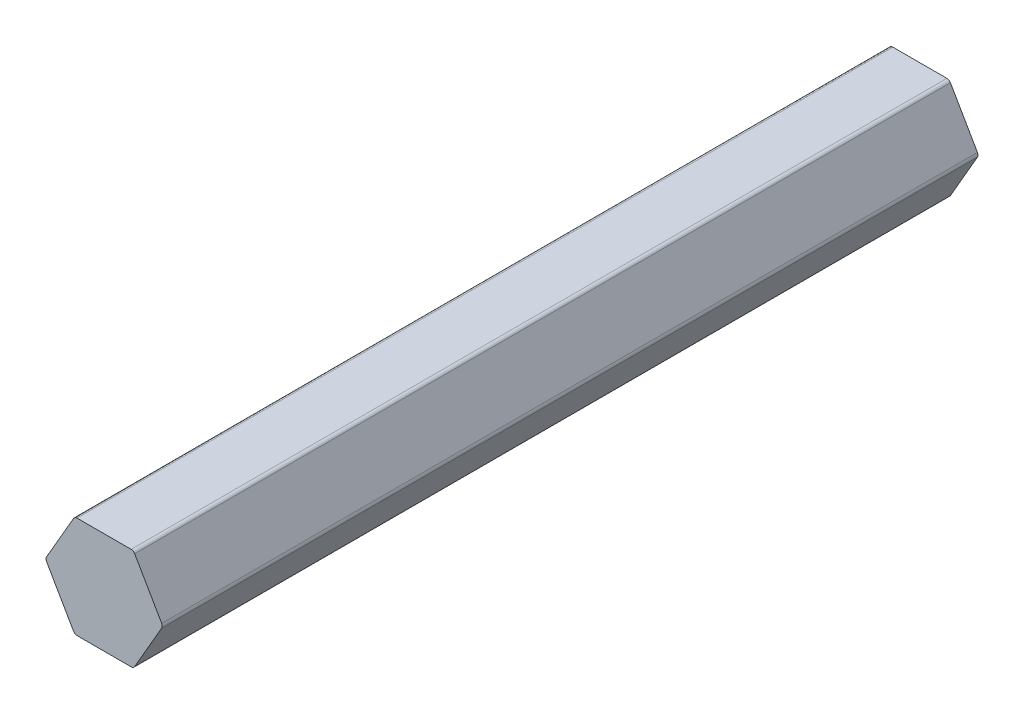
ISO-10303-21;
HEADER;
FILE_DESCRIPTION(('STEP AP214'),'2;1');
FILE_NAME('part.step','',(''),(''),'','','');
FILE_SCHEMA(('AUTOMOTIVE_DESIGN { 1 0 10303 214 1 1 1 1 }'));
ENDSEC;
DATA;
#1=APPLICATION_CONTEXT('core data for automotive mechanical design processes');
#2=APPLICATION_PROTOCOL_DEFINITION('international standard','automotive_design',2000,#1);
#3=PRODUCT_CONTEXT('',#1,'mechanical');
#4=PRODUCT('Part','Part','',(#3));
#5=PRODUCT_RELATED_PRODUCT_CATEGORY('part','',(#4));
#6=PRODUCT_DEFINITION_FORMATION('','',#4);
#7=PRODUCT_DEFINITION_CONTEXT('part definition',#1,'design');
#8=PRODUCT_DEFINITION('design','',#6,#7);
#9=PRODUCT_DEFINITION_SHAPE('','',#8);
#10=(LENGTH_UNIT() NAMED_UNIT(*) SI_UNIT(.MILLI.,.METRE.));
#11=(NAMED_UNIT(*) PLANE_ANGLE_UNIT() SI_UNIT($,.RADIAN.));
#12=(NAMED_UNIT(*) SI_UNIT($,.STERADIAN.) SOLID_ANGLE_UNIT());
#13=UNCERTAINTY_MEASURE_WITH_UNIT(LENGTH_MEASURE(1.E-05),#10,'distance_accuracy_value','');
#14=(GEOMETRIC_REPRESENTATION_CONTEXT(3) GLOBAL_UNCERTAINTY_ASSIGNED_CONTEXT((#13)) GLOBAL_UNIT_ASSIGNED_CONTEXT((#10,
#11,#12)) REPRESENTATION_CONTEXT('',''));
#15=CARTESIAN_POINT('',(0.,0.,0.));
#16=DIRECTION('',(0.,0.,1.));
#17=DIRECTION('',(1.,0.,0.));
#18=AXIS2_PLACEMENT_3D('',#15,#16,#17);
#19=CARTESIAN_POINT('',(-3.36554792418708,-5.8293,-127.));
#20=DIRECTION('',(0.,0.,-1.));
#21=DIRECTION('',(-1.,0.,0.));
#22=AXIS2_PLACEMENT_3D('',#19,#20,#21);
#23=CYLINDRICAL_SURFACE('',#22,0.507999999999999);
#24=CARTESIAN_POINT('',(-3.36554792418708,-5.8293,-228.6));
#25=DIRECTION('',(0.,0.,-1.));
#26=DIRECTION('',(-1.,0.,0.));
#27=AXIS2_PLACEMENT_3D('',#24,#25,#26);
#28=CIRCLE('',#27,0.507999999999999);
#29=CARTESIAN_POINT('',(-3.36554792418708,-6.3373,-228.6));
#30=VERTEX_POINT('',#29);
#31=CARTESIAN_POINT('',(-3.80548882930957,-6.0833,-228.6));
#32=VERTEX_POINT('',#31);
#33=EDGE_CURVE('E154',#30,#32,#28,.T.);
#34=ORIENTED_EDGE('',*,*,#33,.F.);
#35=DIRECTION('',(0.,0.,-1.));
#36=VECTOR('',#35,1.);
#37=CARTESIAN_POINT('',(-3.36554792418708,-6.3373,-127.));
#38=LINE('',#37,#36);
#39=CARTESIAN_POINT('',(-3.36554792418708,-6.3373,-127.));
#40=VERTEX_POINT('',#39);
#41=EDGE_CURVE('E11',#40,#30,#38,.T.);
#42=ORIENTED_EDGE('',*,*,#41,.F.);
#43=CARTESIAN_POINT('',(-3.36554792418708,-5.8293,-127.));
#44=DIRECTION('',(0.,0.,-1.));
#45=DIRECTION('',(-1.,0.,0.));
#46=AXIS2_PLACEMENT_3D('',#43,#44,#45);
#47=CIRCLE('',#46,0.507999999999999);
#48=CARTESIAN_POINT('',(-3.80548882930957,-6.0833,-127.));
#49=VERTEX_POINT('',#48);
#50=EDGE_CURVE('E186',#40,#49,#47,.T.);
#51=ORIENTED_EDGE('',*,*,#50,.T.);
#52=DIRECTION('',(0.,0.,-1.));
#53=VECTOR('',#52,1.);
#54=CARTESIAN_POINT('',(-3.80548882930957,-6.0833,-127.));
#55=LINE('',#54,#53);
#56=EDGE_CURVE('E36',#49,#32,#55,.T.);
#57=ORIENTED_EDGE('',*,*,#56,.T.);
#58=EDGE_LOOP('',(#34,#42,#51,#57));
#59=FACE_BOUND('',#58,.T.);
#60=ADVANCED_FACE('F33',(#59),#23,.T.);
#61=CARTESIAN_POINT('',(3.36554792418708,-6.3373,-127.));
#62=DIRECTION('',(0.,-1.,0.));
#63=DIRECTION('',(1.,0.,0.));
#64=AXIS2_PLACEMENT_3D('',#61,#62,#63);
#65=PLANE('',#64);
#66=DIRECTION('',(-1.,0.,0.));
#67=VECTOR('',#66,1.);
#68=CARTESIAN_POINT('',(3.36554792418708,-6.3373,-228.6));
#69=LINE('',#68,#67);
#70=CARTESIAN_POINT('',(3.36554792418708,-6.3373,-228.6));
#71=VERTEX_POINT('',#70);
#72=EDGE_CURVE('E184',#71,#30,#69,.T.);
#73=ORIENTED_EDGE('',*,*,#72,.F.);
#74=DIRECTION('',(0.,0.,-1.));
#75=VECTOR('',#74,1.);
#76=CARTESIAN_POINT('',(3.36554792418708,-6.3373,-127.));
#77=LINE('',#76,#75);
#78=CARTESIAN_POINT('',(3.36554792418708,-6.3373,-127.));
#79=VERTEX_POINT('',#78);
#80=EDGE_CURVE('E42',#79,#71,#77,.T.);
#81=ORIENTED_EDGE('',*,*,#80,.F.);
#82=DIRECTION('',(-1.,0.,0.));
#83=VECTOR('',#82,1.);
#84=CARTESIAN_POINT('',(3.36554792418708,-6.3373,-127.));
#85=LINE('',#84,#83);
#86=EDGE_CURVE('E144',#79,#40,#85,.T.);
#87=ORIENTED_EDGE('',*,*,#86,.T.);
#88=ORIENTED_EDGE('',*,*,#41,.T.);
#89=EDGE_LOOP('',(#73,#81,#87,#88));
#90=FACE_BOUND('',#89,.T.);
#91=ADVANCED_FACE('F206',(#90),#65,.T.);
#92=CARTESIAN_POINT('',(3.36554792418709,-5.8293,-127.));
#93=DIRECTION('',(0.,0.,-1.));
#94=DIRECTION('',(-1.,0.,0.));
#95=AXIS2_PLACEMENT_3D('',#92,#93,#94);
#96=CYLINDRICAL_SURFACE('',#95,0.508);
#97=CARTESIAN_POINT('',(3.36554792418709,-5.8293,-228.6));
#98=DIRECTION('',(0.,0.,-1.));
#99=DIRECTION('',(-1.,0.,0.));
#100=AXIS2_PLACEMENT_3D('',#97,#98,#99);
#101=CIRCLE('',#100,0.508);
#102=CARTESIAN_POINT('',(3.80548882930958,-6.0833,-228.6));
#103=VERTEX_POINT('',#102);
#104=EDGE_CURVE('E131',#103,#71,#101,.T.);
#105=ORIENTED_EDGE('',*,*,#104,.F.);
#106=DIRECTION('',(0.,0.,-1.));
#107=VECTOR('',#106,1.);
#108=CARTESIAN_POINT('',(3.80548882930958,-6.0833,-127.));
#109=LINE('',#108,#107);
#110=CARTESIAN_POINT('',(3.80548882930958,-6.0833,-127.));
#111=VERTEX_POINT('',#110);
#112=EDGE_CURVE('E126',#111,#103,#109,.T.);
#113=ORIENTED_EDGE('',*,*,#112,.F.);
#114=CARTESIAN_POINT('',(3.36554792418709,-5.8293,-127.));
#115=DIRECTION('',(0.,0.,-1.));
#116=DIRECTION('',(-1.,0.,0.));
#117=AXIS2_PLACEMENT_3D('',#114,#115,#116);
#118=CIRCLE('',#117,0.508);
#119=EDGE_CURVE('E129',#111,#79,#118,.T.);
#120=ORIENTED_EDGE('',*,*,#119,.T.);
#121=ORIENTED_EDGE('',*,*,#80,.T.);
#122=EDGE_LOOP('',(#105,#113,#120,#121));
#123=FACE_BOUND('',#122,.T.);
#124=ADVANCED_FACE('F128',(#123),#96,.T.);
#125=CARTESIAN_POINT('',(7.17103675349666,-0.253999999999997,-127.));
#126=DIRECTION('',(0.866025403784439,-0.499999999999999,0.));
#127=DIRECTION('',(0.499999999999999,0.866025403784439,0.));
#128=AXIS2_PLACEMENT_3D('',#125,#126,#127);
#129=PLANE('',#128);
#130=DIRECTION('',(-0.499999999999999,-0.866025403784439,0.));
#131=VECTOR('',#130,1.);
#132=CARTESIAN_POINT('',(7.17103675349666,-0.253999999999997,-228.6));
#133=LINE('',#132,#131);
#134=CARTESIAN_POINT('',(7.17103675349666,-0.253999999999997,-228.6));
#135=VERTEX_POINT('',#134);
#136=EDGE_CURVE('E181',#135,#103,#133,.T.);
#137=ORIENTED_EDGE('',*,*,#136,.F.);
#138=DIRECTION('',(0.,0.,-1.));
#139=VECTOR('',#138,1.);
#140=CARTESIAN_POINT('',(7.17103675349666,-0.253999999999997,-127.));
#141=LINE('',#140,#139);
#142=CARTESIAN_POINT('',(7.17103675349666,-0.253999999999997,-127.));
#143=VERTEX_POINT('',#142);
#144=EDGE_CURVE('E136',#143,#135,#141,.T.);
#145=ORIENTED_EDGE('',*,*,#144,.F.);
#146=DIRECTION('',(-0.499999999999999,-0.866025403784439,0.));
#147=VECTOR('',#146,1.);
#148=CARTESIAN_POINT('',(7.17103675349666,-0.253999999999997,-127.));
#149=LINE('',#148,#147);
#150=EDGE_CURVE('E142',#143,#111,#149,.T.);
#151=ORIENTED_EDGE('',*,*,#150,.T.);
#152=ORIENTED_EDGE('',*,*,#112,.T.);
#153=EDGE_LOOP('',(#137,#145,#151,#152));
#154=FACE_BOUND('',#153,.T.);
#155=ADVANCED_FACE('F146',(#154),#129,.T.);
#156=CARTESIAN_POINT('',(6.73109584837417,0.,-127.));
#157=DIRECTION('',(0.,0.,-1.));
#158=DIRECTION('',(-1.,0.,0.));
#159=AXIS2_PLACEMENT_3D('',#156,#157,#158);
#160=CYLINDRICAL_SURFACE('',#159,0.507999999999999);
#161=CARTESIAN_POINT('',(6.73109584837417,0.,-228.6));
#162=DIRECTION('',(0.,0.,-1.));
#163=DIRECTION('',(-1.,0.,0.));
#164=AXIS2_PLACEMENT_3D('',#161,#162,#163);
#165=CIRCLE('',#164,0.507999999999999);
#166=CARTESIAN_POINT('',(7.17103675349666,0.254000000000003,-228.6));
#167=VERTEX_POINT('',#166);
#168=EDGE_CURVE('E178',#167,#135,#165,.T.);
#169=ORIENTED_EDGE('',*,*,#168,.F.);
#170=DIRECTION('',(0.,0.,-1.));
#171=VECTOR('',#170,1.);
#172=CARTESIAN_POINT('',(7.17103675349666,0.254000000000003,-127.));
#173=LINE('',#172,#171);
#174=CARTESIAN_POINT('',(7.17103675349666,0.254000000000003,-127.));
#175=VERTEX_POINT('',#174);
#176=EDGE_CURVE('E190',#175,#167,#173,.T.);
#177=ORIENTED_EDGE('',*,*,#176,.F.);
#178=CARTESIAN_POINT('',(6.73109584837417,0.,-127.));
#179=DIRECTION('',(0.,0.,-1.));
#180=DIRECTION('',(-1.,0.,0.));
#181=AXIS2_PLACEMENT_3D('',#178,#179,#180);
#182=CIRCLE('',#181,0.507999999999999);
#183=EDGE_CURVE('E147',#175,#143,#182,.T.);
#184=ORIENTED_EDGE('',*,*,#183,.T.);
#185=ORIENTED_EDGE('',*,*,#144,.T.);
#186=EDGE_LOOP('',(#169,#177,#184,#185));
#187=FACE_BOUND('',#186,.T.);
#188=ADVANCED_FACE('F219',(#187),#160,.T.);
#189=CARTESIAN_POINT('',(3.80548882930958,6.0833,-127.));
#190=DIRECTION('',(0.866025403784439,0.5,0.));
#191=DIRECTION('',(-0.5,0.866025403784439,0.));
#192=AXIS2_PLACEMENT_3D('',#189,#190,#191);
#193=PLANE('',#192);
#194=DIRECTION('',(0.5,-0.866025403784439,0.));
#195=VECTOR('',#194,1.);
#196=CARTESIAN_POINT('',(3.80548882930958,6.0833,-228.6));
#197=LINE('',#196,#195);
#198=CARTESIAN_POINT('',(3.80548882930958,6.0833,-228.6));
#199=VERTEX_POINT('',#198);
#200=EDGE_CURVE('E175',#199,#167,#197,.T.);
#201=ORIENTED_EDGE('',*,*,#200,.F.);
#202=DIRECTION('',(0.,0.,-1.));
#203=VECTOR('',#202,1.);
#204=CARTESIAN_POINT('',(3.80548882930958,6.0833,-127.));
#205=LINE('',#204,#203);
#206=CARTESIAN_POINT('',(3.80548882930958,6.0833,-127.));
#207=VERTEX_POINT('',#206);
#208=EDGE_CURVE('E192',#207,#199,#205,.T.);
#209=ORIENTED_EDGE('',*,*,#208,.F.);
#210=DIRECTION('',(0.5,-0.866025403784439,0.));
#211=VECTOR('',#210,1.);
#212=CARTESIAN_POINT('',(3.80548882930958,6.0833,-127.));
#213=LINE('',#212,#211);
#214=EDGE_CURVE('E149',#207,#175,#213,.T.);
#215=ORIENTED_EDGE('',*,*,#214,.T.);
#216=ORIENTED_EDGE('',*,*,#176,.T.);
#217=EDGE_LOOP('',(#201,#209,#215,#216));
#218=FACE_BOUND('',#217,.T.);
#219=ADVANCED_FACE('F222',(#218),#193,.T.);
#220=CARTESIAN_POINT('',(3.36554792418708,5.8293,-127.));
#221=DIRECTION('',(0.,0.,-1.));
#222=DIRECTION('',(-1.,0.,0.));
#223=AXIS2_PLACEMENT_3D('',#220,#221,#222);
#224=CYLINDRICAL_SURFACE('',#223,0.508);
#225=CARTESIAN_POINT('',(3.36554792418708,5.8293,-228.6));
#226=DIRECTION('',(0.,0.,-1.));
#227=DIRECTION('',(-1.,0.,0.));
#228=AXIS2_PLACEMENT_3D('',#225,#226,#227);
#229=CIRCLE('',#228,0.508);
#230=CARTESIAN_POINT('',(3.36554792418708,6.3373,-228.6));
#231=VERTEX_POINT('',#230);
#232=EDGE_CURVE('E172',#231,#199,#229,.T.);
#233=ORIENTED_EDGE('',*,*,#232,.F.);
#234=DIRECTION('',(0.,0.,-1.));
#235=VECTOR('',#234,1.);
#236=CARTESIAN_POINT('',(3.36554792418708,6.3373,-127.));
#237=LINE('',#236,#235);
#238=CARTESIAN_POINT('',(3.36554792418708,6.3373,-127.));
#239=VERTEX_POINT('',#238);
#240=EDGE_CURVE('E194',#239,#231,#237,.T.);
#241=ORIENTED_EDGE('',*,*,#240,.F.);
#242=CARTESIAN_POINT('',(3.36554792418708,5.8293,-127.));
#243=DIRECTION('',(0.,0.,-1.));
#244=DIRECTION('',(-1.,0.,0.));
#245=AXIS2_PLACEMENT_3D('',#242,#243,#244);
#246=CIRCLE('',#245,0.508);
#247=EDGE_CURVE('E348',#239,#207,#246,.T.);
#248=ORIENTED_EDGE('',*,*,#247,.T.);
#249=ORIENTED_EDGE('',*,*,#208,.T.);
#250=EDGE_LOOP('',(#233,#241,#248,#249));
#251=FACE_BOUND('',#250,.T.);
#252=ADVANCED_FACE('F226',(#251),#224,.T.);
#253=CARTESIAN_POINT('',(-3.36554792418708,6.3373,-127.));
#254=DIRECTION('',(0.,1.,0.));
#255=DIRECTION('',(-1.,0.,0.));
#256=AXIS2_PLACEMENT_3D('',#253,#254,#255);
#257=PLANE('',#256);
#258=DIRECTION('',(1.,0.,0.));
#259=VECTOR('',#258,1.);
#260=CARTESIAN_POINT('',(-3.36554792418708,6.3373,-228.6));
#261=LINE('',#260,#259);
#262=CARTESIAN_POINT('',(-3.36554792418708,6.3373,-228.6));
#263=VERTEX_POINT('',#262);
#264=EDGE_CURVE('E169',#263,#231,#261,.T.);
#265=ORIENTED_EDGE('',*,*,#264,.F.);
#266=DIRECTION('',(0.,0.,-1.));
#267=VECTOR('',#266,1.);
#268=CARTESIAN_POINT('',(-3.36554792418708,6.3373,-127.));
#269=LINE('',#268,#267);
#270=CARTESIAN_POINT('',(-3.36554792418708,6.3373,-127.));
#271=VERTEX_POINT('',#270);
#272=EDGE_CURVE('E196',#271,#263,#269,.T.);
#273=ORIENTED_EDGE('',*,*,#272,.F.);
#274=DIRECTION('',(1.,0.,0.));
#275=VECTOR('',#274,1.);
#276=CARTESIAN_POINT('',(-3.36554792418708,6.3373,-127.));
#277=LINE('',#276,#275);
#278=EDGE_CURVE('E352',#271,#239,#277,.T.);
#279=ORIENTED_EDGE('',*,*,#278,.T.);
#280=ORIENTED_EDGE('',*,*,#240,.T.);
#281=EDGE_LOOP('',(#265,#273,#279,#280));
#282=FACE_BOUND('',#281,.T.);
#283=ADVANCED_FACE('F230',(#282),#257,.T.);
#284=CARTESIAN_POINT('',(-3.36554792418708,5.8293,-127.));
#285=DIRECTION('',(0.,0.,-1.));
#286=DIRECTION('',(-1.,0.,0.));
#287=AXIS2_PLACEMENT_3D('',#284,#285,#286);
#288=CYLINDRICAL_SURFACE('',#287,0.508);
#289=CARTESIAN_POINT('',(-3.36554792418708,5.8293,-228.6));
#290=DIRECTION('',(0.,0.,-1.));
#291=DIRECTION('',(-1.,0.,0.));
#292=AXIS2_PLACEMENT_3D('',#289,#290,#291);
#293=CIRCLE('',#292,0.508);
#294=CARTESIAN_POINT('',(-3.80548882930958,6.0833,-228.6));
#295=VERTEX_POINT('',#294);
#296=EDGE_CURVE('E166',#295,#263,#293,.T.);
#297=ORIENTED_EDGE('',*,*,#296,.F.);
#298=DIRECTION('',(0.,0.,-1.));
#299=VECTOR('',#298,1.);
#300=CARTESIAN_POINT('',(-3.80548882930958,6.0833,-127.));
#301=LINE('',#300,#299);
#302=CARTESIAN_POINT('',(-3.80548882930958,6.0833,-127.));
#303=VERTEX_POINT('',#302);
#304=EDGE_CURVE('E198',#303,#295,#301,.T.);
#305=ORIENTED_EDGE('',*,*,#304,.F.);
#306=CARTESIAN_POINT('',(-3.36554792418708,5.8293,-127.));
#307=DIRECTION('',(0.,0.,-1.));
#308=DIRECTION('',(-1.,0.,0.));
#309=AXIS2_PLACEMENT_3D('',#306,#307,#308);
#310=CIRCLE('',#309,0.508);
#311=EDGE_CURVE('E341',#303,#271,#310,.T.);
#312=ORIENTED_EDGE('',*,*,#311,.T.);
#313=ORIENTED_EDGE('',*,*,#272,.T.);
#314=EDGE_LOOP('',(#297,#305,#312,#313));
#315=FACE_BOUND('',#314,.T.);
#316=ADVANCED_FACE('F234',(#315),#288,.T.);
#317=CARTESIAN_POINT('',(-7.17103675349666,0.253999999999996,-127.));
#318=DIRECTION('',(-0.866025403784439,0.5,0.));
#319=DIRECTION('',(-0.5,-0.866025403784439,0.));
#320=AXIS2_PLACEMENT_3D('',#317,#318,#319);
#321=PLANE('',#320);
#322=DIRECTION('',(0.5,0.866025403784439,0.));
#323=VECTOR('',#322,1.);
#324=CARTESIAN_POINT('',(-7.17103675349666,0.253999999999996,-228.6));
#325=LINE('',#324,#323);
#326=CARTESIAN_POINT('',(-7.17103675349666,0.253999999999996,-228.6));
#327=VERTEX_POINT('',#326);
#328=EDGE_CURVE('E163',#327,#295,#325,.T.);
#329=ORIENTED_EDGE('',*,*,#328,.F.);
#330=DIRECTION('',(0.,0.,-1.));
#331=VECTOR('',#330,1.);
#332=CARTESIAN_POINT('',(-7.17103675349666,0.253999999999996,-127.));
#333=LINE('',#332,#331);
#334=CARTESIAN_POINT('',(-7.17103675349666,0.253999999999996,-127.));
#335=VERTEX_POINT('',#334);
#336=EDGE_CURVE('E200',#335,#327,#333,.T.);
#337=ORIENTED_EDGE('',*,*,#336,.F.);
#338=DIRECTION('',(0.5,0.866025403784439,0.));
#339=VECTOR('',#338,1.);
#340=CARTESIAN_POINT('',(-7.17103675349666,0.253999999999996,-127.));
#341=LINE('',#340,#339);
#342=EDGE_CURVE('E337',#335,#303,#341,.T.);
#343=ORIENTED_EDGE('',*,*,#342,.T.);
#344=ORIENTED_EDGE('',*,*,#304,.T.);
#345=EDGE_LOOP('',(#329,#337,#343,#344));
#346=FACE_BOUND('',#345,.T.);
#347=ADVANCED_FACE('F238',(#346),#321,.T.);
#348=CARTESIAN_POINT('',(-6.73109584837417,0.,-127.));
#349=DIRECTION('',(0.,0.,-1.));
#350=DIRECTION('',(-1.,0.,0.));
#351=AXIS2_PLACEMENT_3D('',#348,#349,#350);
#352=CYLINDRICAL_SURFACE('',#351,0.508000000000001);
#353=CARTESIAN_POINT('',(-6.73109584837417,0.,-228.6));
#354=DIRECTION('',(0.,0.,-1.));
#355=DIRECTION('',(-1.,0.,0.));
#356=AXIS2_PLACEMENT_3D('',#353,#354,#355);
#357=CIRCLE('',#356,0.508000000000001);
#358=CARTESIAN_POINT('',(-7.17103675349666,-0.254000000000005,-228.6));
#359=VERTEX_POINT('',#358);
#360=EDGE_CURVE('E160',#359,#327,#357,.T.);
#361=ORIENTED_EDGE('',*,*,#360,.F.);
#362=DIRECTION('',(0.,0.,-1.));
#363=VECTOR('',#362,1.);
#364=CARTESIAN_POINT('',(-7.17103675349666,-0.254000000000005,-127.));
#365=LINE('',#364,#363);
#366=CARTESIAN_POINT('',(-7.17103675349666,-0.254000000000005,-127.));
#367=VERTEX_POINT('',#366);
#368=EDGE_CURVE('E201',#367,#359,#365,.T.);
#369=ORIENTED_EDGE('',*,*,#368,.F.);
#370=CARTESIAN_POINT('',(-6.73109584837417,0.,-127.));
#371=DIRECTION('',(0.,0.,-1.));
#372=DIRECTION('',(-1.,0.,0.));
#373=AXIS2_PLACEMENT_3D('',#370,#371,#372);
#374=CIRCLE('',#373,0.508000000000001);
#375=EDGE_CURVE('E358',#367,#335,#374,.T.);
#376=ORIENTED_EDGE('',*,*,#375,.T.);
#377=ORIENTED_EDGE('',*,*,#336,.T.);
#378=EDGE_LOOP('',(#361,#369,#376,#377));
#379=FACE_BOUND('',#378,.T.);
#380=ADVANCED_FACE('F242',(#379),#352,.T.);
#381=CARTESIAN_POINT('',(-3.80548882930957,-6.0833,-127.));
#382=DIRECTION('',(-0.866025403784438,-0.5,0.));
#383=DIRECTION('',(0.500000000000001,-0.866025403784438,0.));
#384=AXIS2_PLACEMENT_3D('',#381,#382,#383);
#385=PLANE('',#384);
#386=DIRECTION('',(-0.500000000000001,0.866025403784438,0.));
#387=VECTOR('',#386,1.);
#388=CARTESIAN_POINT('',(-3.80548882930957,-6.0833,-228.6));
#389=LINE('',#388,#387);
#390=EDGE_CURVE('E157',#32,#359,#389,.T.);
#391=ORIENTED_EDGE('',*,*,#390,.F.);
#392=ORIENTED_EDGE('',*,*,#56,.F.);
#393=DIRECTION('',(-0.500000000000001,0.866025403784438,0.));
#394=VECTOR('',#393,1.);
#395=CARTESIAN_POINT('',(-3.80548882930957,-6.0833,-127.));
#396=LINE('',#395,#394);
#397=EDGE_CURVE('E360',#49,#367,#396,.T.);
#398=ORIENTED_EDGE('',*,*,#397,.T.);
#399=ORIENTED_EDGE('',*,*,#368,.T.);
#400=EDGE_LOOP('',(#391,#392,#398,#399));
#401=FACE_BOUND('',#400,.T.);
#402=ADVANCED_FACE('F203',(#401),#385,.T.);
#403=CARTESIAN_POINT('',(-3.36554792418708,-5.8293,-127.));
#404=DIRECTION('',(0.,0.,-1.));
#405=DIRECTION('',(-1.,0.,0.));
#406=AXIS2_PLACEMENT_3D('',#403,#404,#405);
#407=PLANE('',#406);
#408=ORIENTED_EDGE('',*,*,#50,.F.);
#409=ORIENTED_EDGE('',*,*,#86,.F.);
#410=ORIENTED_EDGE('',*,*,#119,.F.);
#411=ORIENTED_EDGE('',*,*,#150,.F.);
#412=ORIENTED_EDGE('',*,*,#183,.F.);
#413=ORIENTED_EDGE('',*,*,#214,.F.);
#414=ORIENTED_EDGE('',*,*,#247,.F.);
#415=ORIENTED_EDGE('',*,*,#278,.F.);
#416=ORIENTED_EDGE('',*,*,#311,.F.);
#417=ORIENTED_EDGE('',*,*,#342,.F.);
#418=ORIENTED_EDGE('',*,*,#375,.F.);
#419=ORIENTED_EDGE('',*,*,#397,.F.);
#420=EDGE_LOOP('',(#408,#409,#410,#411,#412,#413,#414,#415,#416,#417,#418,#419));
#421=FACE_BOUND('',#420,.T.);
#422=ADVANCED_FACE('F140',(#421),#407,.F.);
#423=CARTESIAN_POINT('',(-3.36554792418708,-5.8293,-228.6));
#424=DIRECTION('',(0.,0.,-1.));
#425=DIRECTION('',(-1.,0.,0.));
#426=AXIS2_PLACEMENT_3D('',#423,#424,#425);
#427=PLANE('',#426);
#428=ORIENTED_EDGE('',*,*,#33,.T.);
#429=ORIENTED_EDGE('',*,*,#390,.T.);
#430=ORIENTED_EDGE('',*,*,#360,.T.);
#431=ORIENTED_EDGE('',*,*,#328,.T.);
#432=ORIENTED_EDGE('',*,*,#296,.T.);
#433=ORIENTED_EDGE('',*,*,#264,.T.);
#434=ORIENTED_EDGE('',*,*,#232,.T.);
#435=ORIENTED_EDGE('',*,*,#200,.T.);
#436=ORIENTED_EDGE('',*,*,#168,.T.);
#437=ORIENTED_EDGE('',*,*,#136,.T.);
#438=ORIENTED_EDGE('',*,*,#104,.T.);
#439=ORIENTED_EDGE('',*,*,#72,.T.);
#440=EDGE_LOOP('',(#428,#429,#430,#431,#432,#433,#434,#435,#436,#437,#438,#439));
#441=FACE_BOUND('',#440,.T.);
#442=ADVANCED_FACE('F205',(#441),#427,.T.);
#443=CLOSED_SHELL('',(#60,#91,#124,#155,#188,#219,#252,#283,#316,#347,#380,#402,#422,#442));
#444=MANIFOLD_SOLID_BREP('B2',#443);
#445=ADVANCED_BREP_SHAPE_REPRESENTATION('',(#18,#444),#14);
#446=SHAPE_DEFINITION_REPRESENTATION(#9,#445);
ENDSEC;
END-ISO-10303-21;
